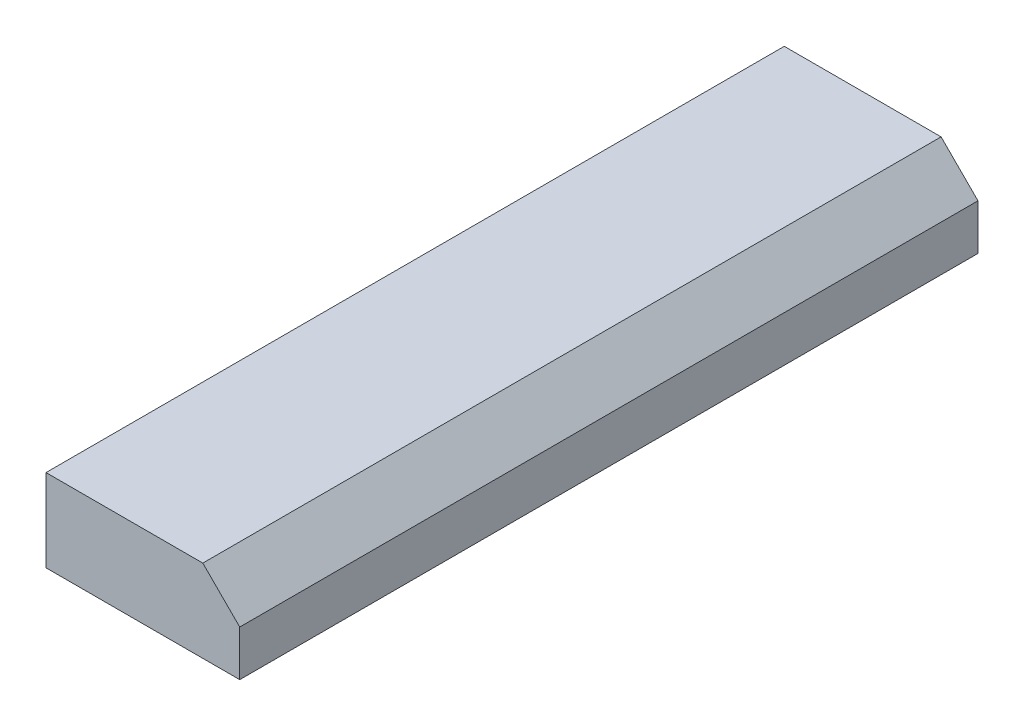
ISO-10303-21;
HEADER;
FILE_DESCRIPTION(('STEP AP214'),'2;1');
FILE_NAME('part.step','',(''),(''),'','','');
FILE_SCHEMA(('AUTOMOTIVE_DESIGN { 1 0 10303 214 1 1 1 1 }'));
ENDSEC;
DATA;
#1=APPLICATION_CONTEXT('core data for automotive mechanical design processes');
#2=APPLICATION_PROTOCOL_DEFINITION('international standard','automotive_design',2000,#1);
#3=PRODUCT_CONTEXT('',#1,'mechanical');
#4=PRODUCT('Part','Part','',(#3));
#5=PRODUCT_RELATED_PRODUCT_CATEGORY('part','',(#4));
#6=PRODUCT_DEFINITION_FORMATION('','',#4);
#7=PRODUCT_DEFINITION_CONTEXT('part definition',#1,'design');
#8=PRODUCT_DEFINITION('design','',#6,#7);
#9=PRODUCT_DEFINITION_SHAPE('','',#8);
#10=(LENGTH_UNIT() NAMED_UNIT(*) SI_UNIT(.MILLI.,.METRE.));
#11=(NAMED_UNIT(*) PLANE_ANGLE_UNIT() SI_UNIT($,.RADIAN.));
#12=(NAMED_UNIT(*) SI_UNIT($,.STERADIAN.) SOLID_ANGLE_UNIT());
#13=UNCERTAINTY_MEASURE_WITH_UNIT(LENGTH_MEASURE(1.E-05),#10,'distance_accuracy_value','');
#14=(GEOMETRIC_REPRESENTATION_CONTEXT(3) GLOBAL_UNCERTAINTY_ASSIGNED_CONTEXT((#13)) GLOBAL_UNIT_ASSIGNED_CONTEXT((#10,
#11,#12)) REPRESENTATION_CONTEXT('',''));
#15=CARTESIAN_POINT('',(0.,0.,0.));
#16=DIRECTION('',(0.,0.,1.));
#17=DIRECTION('',(1.,0.,0.));
#18=AXIS2_PLACEMENT_3D('',#15,#16,#17);
#19=CARTESIAN_POINT('',(-188.551604042434,146.626566288844,200.));
#20=DIRECTION('',(0.,-1.,0.));
#21=DIRECTION('',(0.,0.,-1.));
#22=AXIS2_PLACEMENT_3D('',#19,#20,#21);
#23=PLANE('',#22);
#24=DIRECTION('',(-1.,0.,0.));
#25=VECTOR('',#24,1.);
#26=CARTESIAN_POINT('',(-188.551604042434,146.626566288844,200.));
#27=LINE('',#26,#25);
#28=CARTESIAN_POINT('',(-146.069277216558,146.626566288844,200.));
#29=VERTEX_POINT('',#28);
#30=CARTESIAN_POINT('',(-188.551604042434,146.626566288844,200.));
#31=VERTEX_POINT('',#30);
#32=EDGE_CURVE('E95',#29,#31,#27,.T.);
#33=ORIENTED_EDGE('',*,*,#32,.F.);
#34=DIRECTION('',(0.,0.,-1.));
#35=VECTOR('',#34,1.);
#36=CARTESIAN_POINT('',(-146.069277216558,146.626566288844,200.));
#37=LINE('',#36,#35);
#38=CARTESIAN_POINT('',(-146.069277216558,146.626566288844,0.));
#39=VERTEX_POINT('',#38);
#40=EDGE_CURVE('E121',#29,#39,#37,.T.);
#41=ORIENTED_EDGE('',*,*,#40,.T.);
#42=DIRECTION('',(-1.,0.,0.));
#43=VECTOR('',#42,1.);
#44=CARTESIAN_POINT('',(-188.551604042434,146.626566288844,0.));
#45=LINE('',#44,#43);
#46=CARTESIAN_POINT('',(-188.551604042434,146.626566288844,0.));
#47=VERTEX_POINT('',#46);
#48=EDGE_CURVE('E118',#39,#47,#45,.T.);
#49=ORIENTED_EDGE('',*,*,#48,.T.);
#50=DIRECTION('',(0.,0.,-1.));
#51=VECTOR('',#50,1.);
#52=CARTESIAN_POINT('',(-188.551604042434,146.626566288844,200.));
#53=LINE('',#52,#51);
#54=EDGE_CURVE('E111',#31,#47,#53,.T.);
#55=ORIENTED_EDGE('',*,*,#54,.F.);
#56=EDGE_LOOP('',(#33,#41,#49,#55));
#57=FACE_BOUND('',#56,.T.);
#58=ADVANCED_FACE('F47',(#57),#23,.F.);
#59=CARTESIAN_POINT('',(-188.551604042434,146.626566288844,200.));
#60=DIRECTION('',(1.,0.,0.));
#61=DIRECTION('',(0.,0.,-1.));
#62=AXIS2_PLACEMENT_3D('',#59,#60,#61);
#63=PLANE('',#62);
#64=DIRECTION('',(0.,-1.,0.));
#65=VECTOR('',#64,1.);
#66=CARTESIAN_POINT('',(-188.551604042434,146.626566288844,0.));
#67=LINE('',#66,#65);
#68=CARTESIAN_POINT('',(-188.551604042434,124.272982640785,0.));
#69=VERTEX_POINT('',#68);
#70=EDGE_CURVE('E141',#47,#69,#67,.T.);
#71=ORIENTED_EDGE('',*,*,#70,.T.);
#72=DIRECTION('',(0.,0.,-1.));
#73=VECTOR('',#72,1.);
#74=CARTESIAN_POINT('',(-188.551604042434,124.272982640785,200.));
#75=LINE('',#74,#73);
#76=CARTESIAN_POINT('',(-188.551604042434,124.272982640785,200.));
#77=VERTEX_POINT('',#76);
#78=EDGE_CURVE('E113',#77,#69,#75,.T.);
#79=ORIENTED_EDGE('',*,*,#78,.F.);
#80=DIRECTION('',(0.,-1.,0.));
#81=VECTOR('',#80,1.);
#82=CARTESIAN_POINT('',(-188.551604042434,146.626566288844,200.));
#83=LINE('',#82,#81);
#84=EDGE_CURVE('E98',#31,#77,#83,.T.);
#85=ORIENTED_EDGE('',*,*,#84,.F.);
#86=ORIENTED_EDGE('',*,*,#54,.T.);
#87=EDGE_LOOP('',(#71,#79,#85,#86));
#88=FACE_BOUND('',#87,.T.);
#89=ADVANCED_FACE('F110',(#88),#63,.F.);
#90=CARTESIAN_POINT('',(-188.551604042434,124.272982640785,200.));
#91=DIRECTION('',(0.,1.,0.));
#92=DIRECTION('',(0.,0.,1.));
#93=AXIS2_PLACEMENT_3D('',#90,#91,#92);
#94=PLANE('',#93);
#95=DIRECTION('',(1.,0.,0.));
#96=VECTOR('',#95,1.);
#97=CARTESIAN_POINT('',(-188.551604042434,124.272982640785,0.));
#98=LINE('',#97,#96);
#99=CARTESIAN_POINT('',(-136.069277216558,124.272982640785,0.));
#100=VERTEX_POINT('',#99);
#101=EDGE_CURVE('E138',#69,#100,#98,.T.);
#102=ORIENTED_EDGE('',*,*,#101,.T.);
#103=DIRECTION('',(0.,0.,-1.));
#104=VECTOR('',#103,1.);
#105=CARTESIAN_POINT('',(-136.069277216558,124.272982640785,200.));
#106=LINE('',#105,#104);
#107=CARTESIAN_POINT('',(-136.069277216558,124.272982640785,200.));
#108=VERTEX_POINT('',#107);
#109=EDGE_CURVE('E126',#108,#100,#106,.T.);
#110=ORIENTED_EDGE('',*,*,#109,.F.);
#111=DIRECTION('',(1.,0.,0.));
#112=VECTOR('',#111,1.);
#113=CARTESIAN_POINT('',(-188.551604042434,124.272982640785,200.));
#114=LINE('',#113,#112);
#115=EDGE_CURVE('E116',#77,#108,#114,.T.);
#116=ORIENTED_EDGE('',*,*,#115,.F.);
#117=ORIENTED_EDGE('',*,*,#78,.T.);
#118=EDGE_LOOP('',(#102,#110,#116,#117));
#119=FACE_BOUND('',#118,.T.);
#120=ADVANCED_FACE('F151',(#119),#94,.F.);
#121=CARTESIAN_POINT('',(-136.069277216558,146.626566288844,200.));
#122=DIRECTION('',(-1.,0.,0.));
#123=DIRECTION('',(0.,0.,1.));
#124=AXIS2_PLACEMENT_3D('',#121,#122,#123);
#125=PLANE('',#124);
#126=DIRECTION('',(0.,1.,0.));
#127=VECTOR('',#126,1.);
#128=CARTESIAN_POINT('',(-136.069277216558,146.626566288844,0.));
#129=LINE('',#128,#127);
#130=CARTESIAN_POINT('',(-136.069277216558,136.626566288844,0.));
#131=VERTEX_POINT('',#130);
#132=EDGE_CURVE('E106',#100,#131,#129,.T.);
#133=ORIENTED_EDGE('',*,*,#132,.T.);
#134=DIRECTION('',(0.,0.,1.));
#135=VECTOR('',#134,1.);
#136=CARTESIAN_POINT('',(-136.069277216558,136.626566288844,200.));
#137=LINE('',#136,#135);
#138=CARTESIAN_POINT('',(-136.069277216558,136.626566288844,200.));
#139=VERTEX_POINT('',#138);
#140=EDGE_CURVE('E57',#131,#139,#137,.T.);
#141=ORIENTED_EDGE('',*,*,#140,.T.);
#142=DIRECTION('',(0.,1.,0.));
#143=VECTOR('',#142,1.);
#144=CARTESIAN_POINT('',(-136.069277216558,146.626566288844,200.));
#145=LINE('',#144,#143);
#146=EDGE_CURVE('E135',#108,#139,#145,.T.);
#147=ORIENTED_EDGE('',*,*,#146,.F.);
#148=ORIENTED_EDGE('',*,*,#109,.T.);
#149=EDGE_LOOP('',(#133,#141,#147,#148));
#150=FACE_BOUND('',#149,.T.);
#151=ADVANCED_FACE('F153',(#150),#125,.F.);
#152=CARTESIAN_POINT('',(0.,0.,200.));
#153=DIRECTION('',(0.,0.,-1.));
#154=DIRECTION('',(-1.,0.,0.));
#155=AXIS2_PLACEMENT_3D('',#152,#153,#154);
#156=PLANE('',#155);
#157=ORIENTED_EDGE('',*,*,#146,.T.);
#158=DIRECTION('',(0.707106781186548,-0.707106781186548,0.));
#159=VECTOR('',#158,1.);
#160=CARTESIAN_POINT('',(-146.069277216558,146.626566288844,200.));
#161=LINE('',#160,#159);
#162=EDGE_CURVE('E11',#139,#29,#161,.F.);
#163=ORIENTED_EDGE('',*,*,#162,.T.);
#164=ORIENTED_EDGE('',*,*,#32,.T.);
#165=ORIENTED_EDGE('',*,*,#84,.T.);
#166=ORIENTED_EDGE('',*,*,#115,.T.);
#167=EDGE_LOOP('',(#157,#163,#164,#165,#166));
#168=FACE_BOUND('',#167,.T.);
#169=ADVANCED_FACE('F97',(#168),#156,.F.);
#170=CARTESIAN_POINT('',(0.,0.,0.));
#171=DIRECTION('',(0.,0.,-1.));
#172=DIRECTION('',(-1.,0.,0.));
#173=AXIS2_PLACEMENT_3D('',#170,#171,#172);
#174=PLANE('',#173);
#175=ORIENTED_EDGE('',*,*,#48,.F.);
#176=DIRECTION('',(-0.707106781186548,0.707106781186548,0.));
#177=VECTOR('',#176,1.);
#178=CARTESIAN_POINT('',(0.278644536143188,0.278644536143188,0.));
#179=LINE('',#178,#177);
#180=EDGE_CURVE('E71',#39,#131,#179,.F.);
#181=ORIENTED_EDGE('',*,*,#180,.T.);
#182=ORIENTED_EDGE('',*,*,#132,.F.);
#183=ORIENTED_EDGE('',*,*,#101,.F.);
#184=ORIENTED_EDGE('',*,*,#70,.F.);
#185=EDGE_LOOP('',(#175,#181,#182,#183,#184));
#186=FACE_BOUND('',#185,.T.);
#187=ADVANCED_FACE('F160',(#186),#174,.T.);
#188=CARTESIAN_POINT('',(-146.069277216558,146.626566288844,200.));
#189=DIRECTION('',(-0.707106781186547,-0.707106781186547,0.));
#190=DIRECTION('',(0.,0.,-1.));
#191=AXIS2_PLACEMENT_3D('',#188,#189,#190);
#192=PLANE('',#191);
#193=ORIENTED_EDGE('',*,*,#162,.F.);
#194=ORIENTED_EDGE('',*,*,#140,.F.);
#195=ORIENTED_EDGE('',*,*,#180,.F.);
#196=ORIENTED_EDGE('',*,*,#40,.F.);
#197=EDGE_LOOP('',(#193,#194,#195,#196));
#198=FACE_BOUND('',#197,.T.);
#199=ADVANCED_FACE('F50',(#198),#192,.F.);
#200=CLOSED_SHELL('',(#58,#89,#120,#151,#169,#187,#199));
#201=MANIFOLD_SOLID_BREP('B2',#200);
#202=ADVANCED_BREP_SHAPE_REPRESENTATION('',(#18,#201),#14);
#203=SHAPE_DEFINITION_REPRESENTATION(#9,#202);
ENDSEC;
END-ISO-10303-21;
